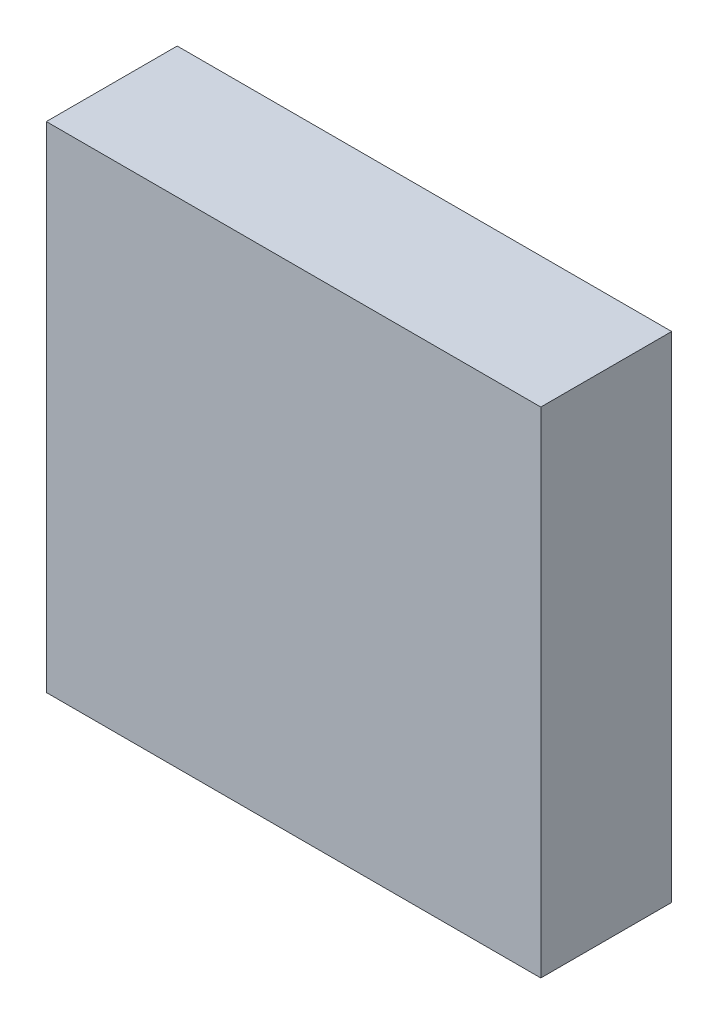
ISO-10303-21;
HEADER;
FILE_DESCRIPTION(('STEP AP214'),'2;1');
FILE_NAME('part.step','',(''),(''),'','','');
FILE_SCHEMA(('AUTOMOTIVE_DESIGN { 1 0 10303 214 1 1 1 1 }'));
ENDSEC;
DATA;
#1=APPLICATION_CONTEXT('core data for automotive mechanical design processes');
#2=APPLICATION_PROTOCOL_DEFINITION('international standard','automotive_design',2000,#1);
#3=PRODUCT_CONTEXT('',#1,'mechanical');
#4=PRODUCT('Part','Part','',(#3));
#5=PRODUCT_RELATED_PRODUCT_CATEGORY('part','',(#4));
#6=PRODUCT_DEFINITION_FORMATION('','',#4);
#7=PRODUCT_DEFINITION_CONTEXT('part definition',#1,'design');
#8=PRODUCT_DEFINITION('design','',#6,#7);
#9=PRODUCT_DEFINITION_SHAPE('','',#8);
#10=(LENGTH_UNIT() NAMED_UNIT(*) SI_UNIT(.MILLI.,.METRE.));
#11=(NAMED_UNIT(*) PLANE_ANGLE_UNIT() SI_UNIT($,.RADIAN.));
#12=(NAMED_UNIT(*) SI_UNIT($,.STERADIAN.) SOLID_ANGLE_UNIT());
#13=UNCERTAINTY_MEASURE_WITH_UNIT(LENGTH_MEASURE(1.E-05),#10,'distance_accuracy_value','');
#14=(GEOMETRIC_REPRESENTATION_CONTEXT(3) GLOBAL_UNCERTAINTY_ASSIGNED_CONTEXT((#13)) GLOBAL_UNIT_ASSIGNED_CONTEXT((#10,
#11,#12)) REPRESENTATION_CONTEXT('',''));
#15=CARTESIAN_POINT('',(0.,0.,0.));
#16=DIRECTION('',(0.,0.,1.));
#17=DIRECTION('',(1.,0.,0.));
#18=AXIS2_PLACEMENT_3D('',#15,#16,#17);
#19=CARTESIAN_POINT('',(7.5,-7.5,3.97));
#20=DIRECTION('',(-1.,0.,0.));
#21=DIRECTION('',(0.,0.,1.));
#22=AXIS2_PLACEMENT_3D('',#19,#20,#21);
#23=PLANE('',#22);
#24=DIRECTION('',(0.,1.,0.));
#25=VECTOR('',#24,1.);
#26=CARTESIAN_POINT('',(7.5,-7.5,0.));
#27=LINE('',#26,#25);
#28=CARTESIAN_POINT('',(7.5,-7.5,0.));
#29=VERTEX_POINT('',#28);
#30=CARTESIAN_POINT('',(7.5,7.5,0.));
#31=VERTEX_POINT('',#30);
#32=EDGE_CURVE('E96',#29,#31,#27,.T.);
#33=ORIENTED_EDGE('',*,*,#32,.T.);
#34=DIRECTION('',(0.,0.,-1.));
#35=VECTOR('',#34,1.);
#36=CARTESIAN_POINT('',(7.5,7.5,3.97));
#37=LINE('',#36,#35);
#38=CARTESIAN_POINT('',(7.5,7.5,3.97));
#39=VERTEX_POINT('',#38);
#40=EDGE_CURVE('E11',#39,#31,#37,.T.);
#41=ORIENTED_EDGE('',*,*,#40,.F.);
#42=DIRECTION('',(0.,1.,0.));
#43=VECTOR('',#42,1.);
#44=CARTESIAN_POINT('',(7.5,-7.5,3.97));
#45=LINE('',#44,#43);
#46=CARTESIAN_POINT('',(7.5,-7.5,3.97));
#47=VERTEX_POINT('',#46);
#48=EDGE_CURVE('E84',#47,#39,#45,.T.);
#49=ORIENTED_EDGE('',*,*,#48,.F.);
#50=DIRECTION('',(0.,0.,-1.));
#51=VECTOR('',#50,1.);
#52=CARTESIAN_POINT('',(7.5,-7.5,3.97));
#53=LINE('',#52,#51);
#54=EDGE_CURVE('E92',#47,#29,#53,.T.);
#55=ORIENTED_EDGE('',*,*,#54,.T.);
#56=EDGE_LOOP('',(#33,#41,#49,#55));
#57=FACE_BOUND('',#56,.T.);
#58=ADVANCED_FACE('F33',(#57),#23,.F.);
#59=CARTESIAN_POINT('',(-7.5,7.5,3.97));
#60=DIRECTION('',(0.,-1.,0.));
#61=DIRECTION('',(0.,0.,-1.));
#62=AXIS2_PLACEMENT_3D('',#59,#60,#61);
#63=PLANE('',#62);
#64=DIRECTION('',(-1.,0.,0.));
#65=VECTOR('',#64,1.);
#66=CARTESIAN_POINT('',(-7.5,7.5,0.));
#67=LINE('',#66,#65);
#68=CARTESIAN_POINT('',(-7.5,7.5,0.));
#69=VERTEX_POINT('',#68);
#70=EDGE_CURVE('E88',#31,#69,#67,.T.);
#71=ORIENTED_EDGE('',*,*,#70,.T.);
#72=DIRECTION('',(0.,0.,-1.));
#73=VECTOR('',#72,1.);
#74=CARTESIAN_POINT('',(-7.5,7.5,3.97));
#75=LINE('',#74,#73);
#76=CARTESIAN_POINT('',(-7.5,7.5,3.97));
#77=VERTEX_POINT('',#76);
#78=EDGE_CURVE('E41',#77,#69,#75,.T.);
#79=ORIENTED_EDGE('',*,*,#78,.F.);
#80=DIRECTION('',(-1.,0.,0.));
#81=VECTOR('',#80,1.);
#82=CARTESIAN_POINT('',(-7.5,7.5,3.97));
#83=LINE('',#82,#81);
#84=EDGE_CURVE('E79',#39,#77,#83,.T.);
#85=ORIENTED_EDGE('',*,*,#84,.F.);
#86=ORIENTED_EDGE('',*,*,#40,.T.);
#87=EDGE_LOOP('',(#71,#79,#85,#86));
#88=FACE_BOUND('',#87,.T.);
#89=ADVANCED_FACE('F87',(#88),#63,.F.);
#90=CARTESIAN_POINT('',(-7.5,-7.5,3.97));
#91=DIRECTION('',(1.,0.,0.));
#92=DIRECTION('',(0.,0.,-1.));
#93=AXIS2_PLACEMENT_3D('',#90,#91,#92);
#94=PLANE('',#93);
#95=DIRECTION('',(0.,-1.,0.));
#96=VECTOR('',#95,1.);
#97=CARTESIAN_POINT('',(-7.5,-7.5,0.));
#98=LINE('',#97,#96);
#99=CARTESIAN_POINT('',(-7.5,-7.5,0.));
#100=VERTEX_POINT('',#99);
#101=EDGE_CURVE('E66',#69,#100,#98,.T.);
#102=ORIENTED_EDGE('',*,*,#101,.T.);
#103=DIRECTION('',(0.,0.,-1.));
#104=VECTOR('',#103,1.);
#105=CARTESIAN_POINT('',(-7.5,-7.5,3.97));
#106=LINE('',#105,#104);
#107=CARTESIAN_POINT('',(-7.5,-7.5,3.97));
#108=VERTEX_POINT('',#107);
#109=EDGE_CURVE('E89',#108,#100,#106,.T.);
#110=ORIENTED_EDGE('',*,*,#109,.F.);
#111=DIRECTION('',(0.,-1.,0.));
#112=VECTOR('',#111,1.);
#113=CARTESIAN_POINT('',(-7.5,-7.5,3.97));
#114=LINE('',#113,#112);
#115=EDGE_CURVE('E82',#77,#108,#114,.T.);
#116=ORIENTED_EDGE('',*,*,#115,.F.);
#117=ORIENTED_EDGE('',*,*,#78,.T.);
#118=EDGE_LOOP('',(#102,#110,#116,#117));
#119=FACE_BOUND('',#118,.T.);
#120=ADVANCED_FACE('F90',(#119),#94,.F.);
#121=CARTESIAN_POINT('',(-7.5,-7.5,3.97));
#122=DIRECTION('',(0.,1.,0.));
#123=DIRECTION('',(0.,0.,1.));
#124=AXIS2_PLACEMENT_3D('',#121,#122,#123);
#125=PLANE('',#124);
#126=DIRECTION('',(1.,0.,0.));
#127=VECTOR('',#126,1.);
#128=CARTESIAN_POINT('',(-7.5,-7.5,0.));
#129=LINE('',#128,#127);
#130=EDGE_CURVE('E72',#100,#29,#129,.T.);
#131=ORIENTED_EDGE('',*,*,#130,.T.);
#132=ORIENTED_EDGE('',*,*,#54,.F.);
#133=DIRECTION('',(1.,0.,0.));
#134=VECTOR('',#133,1.);
#135=CARTESIAN_POINT('',(-7.5,-7.5,3.97));
#136=LINE('',#135,#134);
#137=EDGE_CURVE('E49',#108,#47,#136,.T.);
#138=ORIENTED_EDGE('',*,*,#137,.F.);
#139=ORIENTED_EDGE('',*,*,#109,.T.);
#140=EDGE_LOOP('',(#131,#132,#138,#139));
#141=FACE_BOUND('',#140,.T.);
#142=ADVANCED_FACE('F103',(#141),#125,.F.);
#143=CARTESIAN_POINT('',(0.,0.,3.97));
#144=DIRECTION('',(0.,0.,-1.));
#145=DIRECTION('',(-1.,0.,0.));
#146=AXIS2_PLACEMENT_3D('',#143,#144,#145);
#147=PLANE('',#146);
#148=ORIENTED_EDGE('',*,*,#48,.T.);
#149=ORIENTED_EDGE('',*,*,#84,.T.);
#150=ORIENTED_EDGE('',*,*,#115,.T.);
#151=ORIENTED_EDGE('',*,*,#137,.T.);
#152=EDGE_LOOP('',(#148,#149,#150,#151));
#153=FACE_BOUND('',#152,.T.);
#154=ADVANCED_FACE('F80',(#153),#147,.F.);
#155=CARTESIAN_POINT('',(0.,0.,0.));
#156=DIRECTION('',(0.,0.,-1.));
#157=DIRECTION('',(-1.,0.,0.));
#158=AXIS2_PLACEMENT_3D('',#155,#156,#157);
#159=PLANE('',#158);
#160=ORIENTED_EDGE('',*,*,#32,.F.);
#161=ORIENTED_EDGE('',*,*,#130,.F.);
#162=ORIENTED_EDGE('',*,*,#101,.F.);
#163=ORIENTED_EDGE('',*,*,#70,.F.);
#164=EDGE_LOOP('',(#160,#161,#162,#163));
#165=FACE_BOUND('',#164,.T.);
#166=ADVANCED_FACE('F106',(#165),#159,.T.);
#167=CLOSED_SHELL('',(#58,#89,#120,#142,#154,#166));
#168=MANIFOLD_SOLID_BREP('B2',#167);
#169=ADVANCED_BREP_SHAPE_REPRESENTATION('',(#18,#168),#14);
#170=SHAPE_DEFINITION_REPRESENTATION(#9,#169);
ENDSEC;
END-ISO-10303-21;
